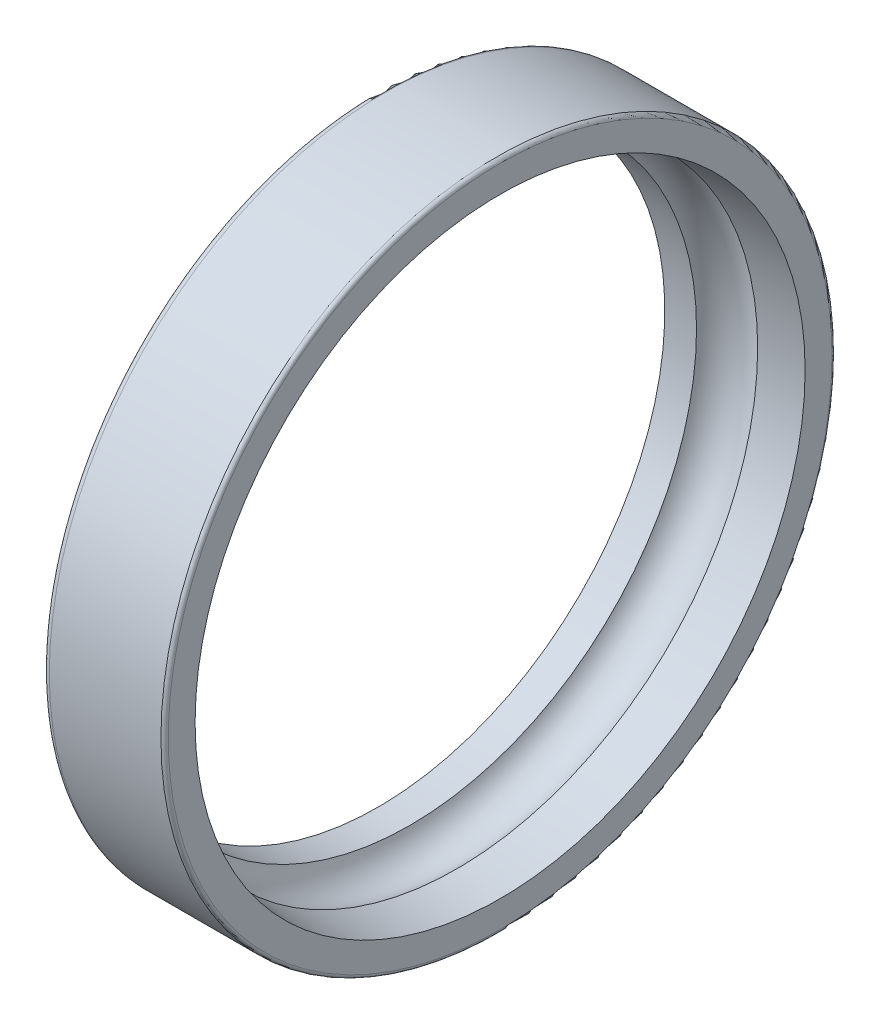
ISO-10303-21;
HEADER;
FILE_DESCRIPTION(('STEP AP214'),'2;1');
FILE_NAME('part.step','',(''),(''),'','','');
FILE_SCHEMA(('AUTOMOTIVE_DESIGN { 1 0 10303 214 1 1 1 1 }'));
ENDSEC;
DATA;
#1=APPLICATION_CONTEXT('core data for automotive mechanical design processes');
#2=APPLICATION_PROTOCOL_DEFINITION('international standard','automotive_design',2000,#1);
#3=PRODUCT_CONTEXT('',#1,'mechanical');
#4=PRODUCT('Part','Part','',(#3));
#5=PRODUCT_RELATED_PRODUCT_CATEGORY('part','',(#4));
#6=PRODUCT_DEFINITION_FORMATION('','',#4);
#7=PRODUCT_DEFINITION_CONTEXT('part definition',#1,'design');
#8=PRODUCT_DEFINITION('design','',#6,#7);
#9=PRODUCT_DEFINITION_SHAPE('','',#8);
#10=(LENGTH_UNIT() NAMED_UNIT(*) SI_UNIT(.MILLI.,.METRE.));
#11=(NAMED_UNIT(*) PLANE_ANGLE_UNIT() SI_UNIT($,.RADIAN.));
#12=(NAMED_UNIT(*) SI_UNIT($,.STERADIAN.) SOLID_ANGLE_UNIT());
#13=UNCERTAINTY_MEASURE_WITH_UNIT(LENGTH_MEASURE(1.E-05),#10,'distance_accuracy_value','');
#14=(GEOMETRIC_REPRESENTATION_CONTEXT(3) GLOBAL_UNCERTAINTY_ASSIGNED_CONTEXT((#13)) GLOBAL_UNIT_ASSIGNED_CONTEXT((#10,
#11,#12)) REPRESENTATION_CONTEXT('',''));
#15=CARTESIAN_POINT('',(0.,0.,0.));
#16=DIRECTION('',(0.,0.,1.));
#17=DIRECTION('',(1.,0.,0.));
#18=AXIS2_PLACEMENT_3D('',#15,#16,#17);
#19=CARTESIAN_POINT('',(10.,0.,0.));
#20=DIRECTION('',(1.,0.,0.));
#21=DIRECTION('',(0.,0.,-1.));
#22=AXIS2_PLACEMENT_3D('',#19,#20,#21);
#23=TOROIDAL_SURFACE('',#22,45.,5.2);
#24=CARTESIAN_POINT('',(12.9163332596601,0.,0.));
#25=DIRECTION('',(1.,0.,0.));
#26=DIRECTION('',(0.,0.,-1.));
#27=AXIS2_PLACEMENT_3D('',#24,#25,#26);
#28=CIRCLE('',#27,49.3052294153274);
#29=CARTESIAN_POINT('',(12.9163332596601,0.,-49.3052294153274));
#30=VERTEX_POINT('',#29);
#31=EDGE_CURVE('E33',#30,#30,#28,.T.);
#32=ORIENTED_EDGE('',*,*,#31,.T.);
#33=EDGE_LOOP('',(#32));
#34=FACE_BOUND('',#33,.T.);
#35=CARTESIAN_POINT('',(5.2,0.,0.));
#36=DIRECTION('',(-1.,0.,0.));
#37=DIRECTION('',(0.,0.,1.));
#38=AXIS2_PLACEMENT_3D('',#35,#36,#37);
#39=CIRCLE('',#38,47.);
#40=CARTESIAN_POINT('',(5.2,0.,47.));
#41=VERTEX_POINT('',#40);
#42=EDGE_CURVE('E30',#41,#41,#39,.T.);
#43=ORIENTED_EDGE('',*,*,#42,.T.);
#44=EDGE_LOOP('',(#43));
#45=FACE_BOUND('',#44,.T.);
#46=ADVANCED_FACE('F14',(#34,#45),#23,.F.);
#47=CARTESIAN_POINT('',(20.,0.,0.));
#48=DIRECTION('',(1.,0.,0.));
#49=DIRECTION('',(0.,0.,-1.));
#50=AXIS2_PLACEMENT_3D('',#47,#48,#49);
#51=CONICAL_SURFACE('',#50,50.,0.0977679395499894);
#52=ORIENTED_EDGE('',*,*,#31,.F.);
#53=EDGE_LOOP('',(#52));
#54=FACE_BOUND('',#53,.T.);
#55=CARTESIAN_POINT('',(20.,0.,0.));
#56=DIRECTION('',(1.,0.,0.));
#57=DIRECTION('',(0.,0.,-1.));
#58=AXIS2_PLACEMENT_3D('',#55,#56,#57);
#59=CIRCLE('',#58,50.);
#60=CARTESIAN_POINT('',(20.,0.,-50.));
#61=VERTEX_POINT('',#60);
#62=EDGE_CURVE('E18',#61,#61,#59,.F.);
#63=ORIENTED_EDGE('',*,*,#62,.F.);
#64=EDGE_LOOP('',(#63));
#65=FACE_BOUND('',#64,.T.);
#66=ADVANCED_FACE('F49',(#54,#65),#51,.F.);
#67=CARTESIAN_POINT('',(20.,0.,0.));
#68=DIRECTION('',(-1.,0.,0.));
#69=DIRECTION('',(0.,0.,1.));
#70=AXIS2_PLACEMENT_3D('',#67,#68,#69);
#71=CYLINDRICAL_SURFACE('',#70,47.);
#72=ORIENTED_EDGE('',*,*,#42,.F.);
#73=EDGE_LOOP('',(#72));
#74=FACE_BOUND('',#73,.T.);
#75=CARTESIAN_POINT('',(0.,0.,0.));
#76=DIRECTION('',(-1.,0.,0.));
#77=DIRECTION('',(0.,0.,1.));
#78=AXIS2_PLACEMENT_3D('',#75,#76,#77);
#79=CIRCLE('',#78,47.);
#80=CARTESIAN_POINT('',(0.,0.,47.));
#81=VERTEX_POINT('',#80);
#82=EDGE_CURVE('E40',#81,#81,#79,.F.);
#83=ORIENTED_EDGE('',*,*,#82,.F.);
#84=EDGE_LOOP('',(#83));
#85=FACE_BOUND('',#84,.T.);
#86=ADVANCED_FACE('F51',(#74,#85),#71,.F.);
#87=CARTESIAN_POINT('',(20.,50.,0.));
#88=DIRECTION('',(1.,0.,0.));
#89=DIRECTION('',(0.,0.,-1.));
#90=AXIS2_PLACEMENT_3D('',#87,#88,#89);
#91=PLANE('',#90);
#92=CARTESIAN_POINT('',(20.,0.,0.));
#93=DIRECTION('',(1.,0.,0.));
#94=DIRECTION('',(0.,0.,-1.));
#95=AXIS2_PLACEMENT_3D('',#92,#93,#94);
#96=CIRCLE('',#95,54.4);
#97=CARTESIAN_POINT('',(20.,0.,-54.4));
#98=VERTEX_POINT('',#97);
#99=EDGE_CURVE('E38',#98,#98,#96,.F.);
#100=ORIENTED_EDGE('',*,*,#99,.F.);
#101=EDGE_LOOP('',(#100));
#102=FACE_BOUND('',#101,.T.);
#103=ORIENTED_EDGE('',*,*,#62,.T.);
#104=EDGE_LOOP('',(#103));
#105=FACE_BOUND('',#104,.T.);
#106=ADVANCED_FACE('F47',(#102,#105),#91,.T.);
#107=CARTESIAN_POINT('',(0.,53.9,0.));
#108=DIRECTION('',(-1.,0.,0.));
#109=DIRECTION('',(0.,0.,1.));
#110=AXIS2_PLACEMENT_3D('',#107,#108,#109);
#111=PLANE('',#110);
#112=ORIENTED_EDGE('',*,*,#82,.T.);
#113=EDGE_LOOP('',(#112));
#114=FACE_BOUND('',#113,.T.);
#115=CARTESIAN_POINT('',(0.,0.,0.));
#116=DIRECTION('',(1.,0.,0.));
#117=DIRECTION('',(0.,0.,-1.));
#118=AXIS2_PLACEMENT_3D('',#115,#116,#117);
#119=CIRCLE('',#118,53.9);
#120=CARTESIAN_POINT('',(0.,0.,-53.9));
#121=VERTEX_POINT('',#120);
#122=EDGE_CURVE('E27',#121,#121,#119,.T.);
#123=ORIENTED_EDGE('',*,*,#122,.F.);
#124=EDGE_LOOP('',(#123));
#125=FACE_BOUND('',#124,.T.);
#126=ADVANCED_FACE('F76',(#114,#125),#111,.T.);
#127=CARTESIAN_POINT('',(19.4,0.,0.));
#128=DIRECTION('',(1.,0.,0.));
#129=DIRECTION('',(0.,0.,-1.));
#130=AXIS2_PLACEMENT_3D('',#127,#128,#129);
#131=TOROIDAL_SURFACE('',#130,54.4,0.6);
#132=ORIENTED_EDGE('',*,*,#99,.T.);
#133=EDGE_LOOP('',(#132));
#134=FACE_BOUND('',#133,.T.);
#135=CARTESIAN_POINT('',(19.4,0.,0.));
#136=DIRECTION('',(-1.,0.,0.));
#137=DIRECTION('',(0.,0.,1.));
#138=AXIS2_PLACEMENT_3D('',#135,#136,#137);
#139=CIRCLE('',#138,55.);
#140=CARTESIAN_POINT('',(19.4,0.,55.));
#141=VERTEX_POINT('',#140);
#142=EDGE_CURVE('E22',#141,#141,#139,.T.);
#143=ORIENTED_EDGE('',*,*,#142,.F.);
#144=EDGE_LOOP('',(#143));
#145=FACE_BOUND('',#144,.T.);
#146=ADVANCED_FACE('F72',(#134,#145),#131,.T.);
#147=CARTESIAN_POINT('',(1.1,0.,0.));
#148=DIRECTION('',(1.,0.,0.));
#149=DIRECTION('',(0.,0.,-1.));
#150=AXIS2_PLACEMENT_3D('',#147,#148,#149);
#151=TOROIDAL_SURFACE('',#150,53.9,1.1);
#152=CARTESIAN_POINT('',(1.1,0.,0.));
#153=DIRECTION('',(-1.,0.,0.));
#154=DIRECTION('',(0.,0.,1.));
#155=AXIS2_PLACEMENT_3D('',#152,#153,#154);
#156=CIRCLE('',#155,55.);
#157=CARTESIAN_POINT('',(1.1,0.,55.));
#158=VERTEX_POINT('',#157);
#159=EDGE_CURVE('E10',#158,#158,#156,.F.);
#160=ORIENTED_EDGE('',*,*,#159,.F.);
#161=EDGE_LOOP('',(#160));
#162=FACE_BOUND('',#161,.T.);
#163=ORIENTED_EDGE('',*,*,#122,.T.);
#164=EDGE_LOOP('',(#163));
#165=FACE_BOUND('',#164,.T.);
#166=ADVANCED_FACE('F16',(#162,#165),#151,.T.);
#167=CARTESIAN_POINT('',(20.,0.,0.));
#168=DIRECTION('',(-1.,0.,0.));
#169=DIRECTION('',(0.,0.,1.));
#170=AXIS2_PLACEMENT_3D('',#167,#168,#169);
#171=CYLINDRICAL_SURFACE('',#170,55.);
#172=ORIENTED_EDGE('',*,*,#159,.T.);
#173=EDGE_LOOP('',(#172));
#174=FACE_BOUND('',#173,.T.);
#175=ORIENTED_EDGE('',*,*,#142,.T.);
#176=EDGE_LOOP('',(#175));
#177=FACE_BOUND('',#176,.T.);
#178=ADVANCED_FACE('F65',(#174,#177),#171,.T.);
#179=CLOSED_SHELL('',(#46,#66,#86,#106,#126,#146,#166,#178));
#180=MANIFOLD_SOLID_BREP('B1',#179);
#181=ADVANCED_BREP_SHAPE_REPRESENTATION('',(#18,#180),#14);
#182=SHAPE_DEFINITION_REPRESENTATION(#9,#181);
ENDSEC;
END-ISO-10303-21;
